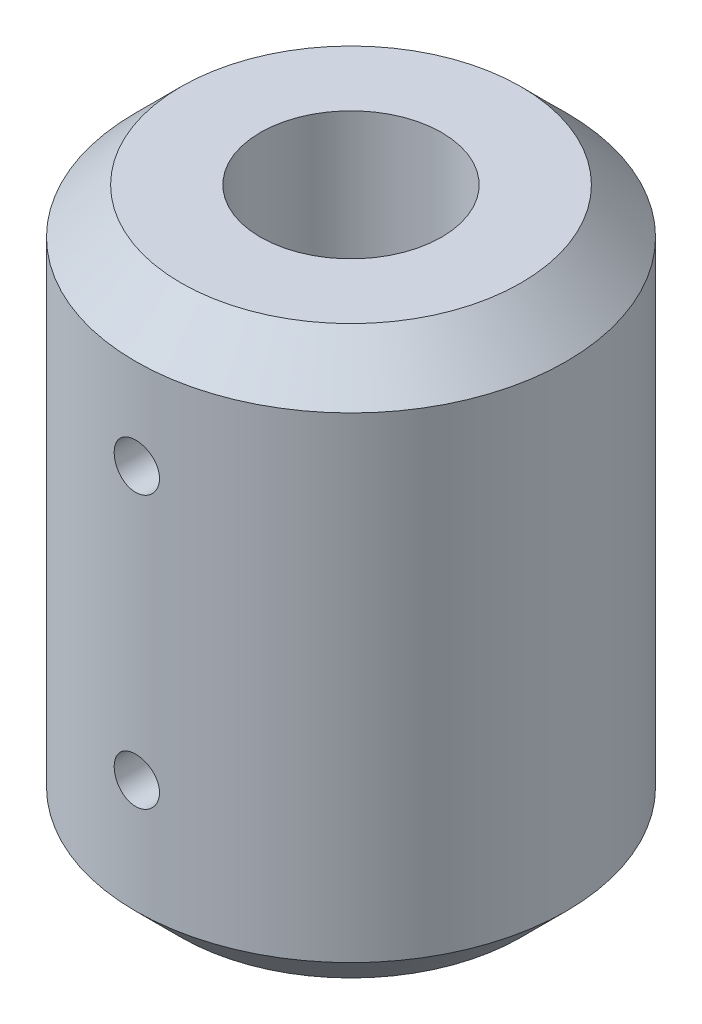
ISO-10303-21;
HEADER;
FILE_DESCRIPTION(('STEP AP214'),'2;1');
FILE_NAME('part.step','',(''),(''),'','','');
FILE_SCHEMA(('AUTOMOTIVE_DESIGN { 1 0 10303 214 1 1 1 1 }'));
ENDSEC;
DATA;
#1=APPLICATION_CONTEXT('core data for automotive mechanical design processes');
#2=APPLICATION_PROTOCOL_DEFINITION('international standard','automotive_design',2000,#1);
#3=PRODUCT_CONTEXT('',#1,'mechanical');
#4=PRODUCT('Part','Part','',(#3));
#5=PRODUCT_RELATED_PRODUCT_CATEGORY('part','',(#4));
#6=PRODUCT_DEFINITION_FORMATION('','',#4);
#7=PRODUCT_DEFINITION_CONTEXT('part definition',#1,'design');
#8=PRODUCT_DEFINITION('design','',#6,#7);
#9=PRODUCT_DEFINITION_SHAPE('','',#8);
#10=(LENGTH_UNIT() NAMED_UNIT(*) SI_UNIT(.MILLI.,.METRE.));
#11=(NAMED_UNIT(*) PLANE_ANGLE_UNIT() SI_UNIT($,.RADIAN.));
#12=(NAMED_UNIT(*) SI_UNIT($,.STERADIAN.) SOLID_ANGLE_UNIT());
#13=UNCERTAINTY_MEASURE_WITH_UNIT(LENGTH_MEASURE(1.E-05),#10,'distance_accuracy_value','');
#14=(GEOMETRIC_REPRESENTATION_CONTEXT(3) GLOBAL_UNCERTAINTY_ASSIGNED_CONTEXT((#13)) GLOBAL_UNIT_ASSIGNED_CONTEXT((#10,
#11,#12)) REPRESENTATION_CONTEXT('',''));
#15=CARTESIAN_POINT('',(0.,0.,0.));
#16=DIRECTION('',(0.,0.,1.));
#17=DIRECTION('',(1.,0.,0.));
#18=AXIS2_PLACEMENT_3D('',#15,#16,#17);
#19=CARTESIAN_POINT('',(0.,15.,0.));
#20=DIRECTION('',(0.,-1.,0.));
#21=DIRECTION('',(0.,0.,-1.));
#22=AXIS2_PLACEMENT_3D('',#19,#20,#21);
#23=CYLINDRICAL_SURFACE('',#22,2.5);
#24=CARTESIAN_POINT('',(1.,7.,2.29128784747792));
#25=CARTESIAN_POINT('',(0.999994127101894,7.05356974904995,2.29129325828211));
#26=CARTESIAN_POINT('',(0.995669909297176,7.10721526735235,2.29319301242133));
#27=CARTESIAN_POINT('',(0.978534515296365,7.21296741643853,2.30055457093922));
#28=CARTESIAN_POINT('',(0.965701652221065,7.26506975854024,2.30602547693426));
#29=CARTESIAN_POINT('',(0.932117516284352,7.36602647098503,2.31980227895648));
#30=CARTESIAN_POINT('',(0.911396076262712,7.41489227368013,2.32809748178557));
#31=CARTESIAN_POINT('',(0.862710134685805,7.50844252542981,2.3465733254764));
#32=CARTESIAN_POINT('',(0.83474721463375,7.55312788457543,2.35675355451961));
#33=CARTESIAN_POINT('',(0.77066098729371,7.63963020112073,2.37850432525516));
#34=CARTESIAN_POINT('',(0.734189678863664,7.68117821146473,2.39011958979373));
#35=CARTESIAN_POINT('',(0.654854552887022,7.75776449865769,2.41306228489405));
#36=CARTESIAN_POINT('',(0.611988510837841,7.79280050064493,2.42438961368186));
#37=CARTESIAN_POINT('',(0.51900315517819,7.85670319849135,2.44601703953427));
#38=CARTESIAN_POINT('',(0.468664482806141,7.88527215073532,2.45625901841784));
#39=CARTESIAN_POINT('',(0.36341266143756,7.9334217841949,2.47401963815773));
#40=CARTESIAN_POINT('',(0.308501384643981,7.95300612289098,2.48153938692337));
#41=CARTESIAN_POINT('',(0.198483213419446,7.9816707432187,2.49269162504142));
#42=CARTESIAN_POINT('',(0.143514492402303,7.99121365704451,2.49649468387678));
#43=CARTESIAN_POINT('',(0.0326331643188255,8.00101424283135,2.50040155341352));
#44=CARTESIAN_POINT('',(-0.0232790829127015,8.00127537796742,2.50050674384656));
#45=CARTESIAN_POINT('',(-0.131116247357656,7.99275861511251,2.49710981410893));
#46=CARTESIAN_POINT('',(-0.183088726437017,7.98448761362654,2.49380998385918));
#47=CARTESIAN_POINT('',(-0.284836554609169,7.96000356184462,2.48424645734395));
#48=CARTESIAN_POINT('',(-0.334611742195079,7.9437899287998,2.47798254360556));
#49=CARTESIAN_POINT('',(-0.431448969255828,7.90368175856185,2.4629841222885));
#50=CARTESIAN_POINT('',(-0.478458811689817,7.87967514259223,2.454213802334));
#51=CARTESIAN_POINT('',(-0.567904075370287,7.8247674965405,2.43507292589849));
#52=CARTESIAN_POINT('',(-0.610337921358054,7.79386410345119,2.42470182132537));
#53=CARTESIAN_POINT('',(-0.692384413996076,7.7236754320267,2.40260818589167));
#54=CARTESIAN_POINT('',(-0.731628922636821,7.68397305370808,2.3908416326012));
#55=CARTESIAN_POINT('',(-0.803053707692663,7.59850471408952,2.36780830482389));
#56=CARTESIAN_POINT('',(-0.835231671879829,7.55273677592292,2.35654169488174));
#57=CARTESIAN_POINT('',(-0.892452094371466,7.45479048879552,2.33548448720906));
#58=CARTESIAN_POINT('',(-0.917267325867452,7.40246758475809,2.3257445709069));
#59=CARTESIAN_POINT('',(-0.957588129983133,7.29389225476899,2.30943795233662));
#60=CARTESIAN_POINT('',(-0.973099749202199,7.23764240761458,2.3028691896167));
#61=CARTESIAN_POINT('',(-0.993477474415979,7.12648211128197,2.29414879836282));
#62=CARTESIAN_POINT('',(-0.998936048404205,7.07169977643992,2.29175183224038));
#63=CARTESIAN_POINT('',(-1.00078066322451,6.96196139611603,2.29094748938549));
#64=CARTESIAN_POINT('',(-0.997169455296441,6.90700540836108,2.29253890281232));
#65=CARTESIAN_POINT('',(-0.981516447394262,6.80177053252256,2.29928022178566));
#66=CARTESIAN_POINT('',(-0.969966531011728,6.75140353130025,2.30422228898885));
#67=CARTESIAN_POINT('',(-0.939402093455638,6.653355797607,2.31685025513936));
#68=CARTESIAN_POINT('',(-0.920385917151196,6.60567566344634,2.32453676244372));
#69=CARTESIAN_POINT('',(-0.874567819740727,6.51219882110226,2.34216890929975));
#70=CARTESIAN_POINT('',(-0.847481434132297,6.46655690565277,2.35219352319567));
#71=CARTESIAN_POINT('',(-0.786582612220937,6.38025850627917,2.37325192578919));
#72=CARTESIAN_POINT('',(-0.752767436740991,6.3396040636022,2.38428612448031));
#73=CARTESIAN_POINT('',(-0.676422105840241,6.26131329570039,2.40710457985699));
#74=CARTESIAN_POINT('',(-0.633432714722549,6.22412171735448,2.41888403642601));
#75=CARTESIAN_POINT('',(-0.541541816684421,6.15741146169483,2.44109897283781));
#76=CARTESIAN_POINT('',(-0.492640069233931,6.12789309670138,2.4515343979662));
#77=CARTESIAN_POINT('',(-0.39013996700088,6.07747618676939,2.46991857950143));
#78=CARTESIAN_POINT('',(-0.336542740497033,6.05657557791711,2.47786793120137));
#79=CARTESIAN_POINT('',(-0.226196795459613,6.02422557379619,2.49036356734645));
#80=CARTESIAN_POINT('',(-0.169449805147135,6.01277104927997,2.49491169853772));
#81=CARTESIAN_POINT('',(-0.0584082551731512,6.00024764918731,2.49989504105256));
#82=CARTESIAN_POINT('',(-0.00419524629652732,5.99854993576867,2.50057923372437));
#83=CARTESIAN_POINT('',(0.103716917866622,6.00392773964205,2.49843021189296));
#84=CARTESIAN_POINT('',(0.157416149697311,6.01100192889281,2.49559752983456));
#85=CARTESIAN_POINT('',(0.261085450973206,6.03327339417924,2.48685756682127));
#86=CARTESIAN_POINT('',(0.311119402324193,6.04821447303778,2.48104740317165));
#87=CARTESIAN_POINT('',(0.407961177379471,6.08552640228091,2.46697473916019));
#88=CARTESIAN_POINT('',(0.454768404133639,6.10789862301017,2.45871178652006));
#89=CARTESIAN_POINT('',(0.546101520928058,6.16055159924467,2.44009047180029));
#90=CARTESIAN_POINT('',(0.590435193403213,6.19113814744254,2.42965564864115));
#91=CARTESIAN_POINT('',(0.673527014262037,6.25889425958947,2.40794701593224));
#92=CARTESIAN_POINT('',(0.712282842872878,6.29606654823006,2.3966728602525));
#93=CARTESIAN_POINT('',(0.785600632542996,6.37865761226253,2.37368881779711));
#94=CARTESIAN_POINT('',(0.819754443599515,6.42444443670056,2.36199516302692));
#95=CARTESIAN_POINT('',(0.879923725219699,6.52147106871439,2.3402483573759));
#96=CARTESIAN_POINT('',(0.905938238949995,6.57271151645493,2.33019539943728));
#97=CARTESIAN_POINT('',(0.946995543836655,6.67451860092404,2.31379432228954));
#98=CARTESIAN_POINT('',(0.962813757082103,6.72473261737559,2.30719459305824));
#99=CARTESIAN_POINT('',(0.986358878909192,6.82724270981517,2.29723001801982));
#100=CARTESIAN_POINT('',(0.994108333944007,6.87953255798348,2.29385616036088));
#101=CARTESIAN_POINT('',(0.999232129155086,6.95468878116896,2.29162229378817));
#102=CARTESIAN_POINT('',(1.00000248449744,6.9773376104988,2.29128555846679));
#103=CARTESIAN_POINT('',(1.,7.,2.29128784747792));
#104=B_SPLINE_CURVE_WITH_KNOTS('',3,(#24,#25,#26,#27,#28,#29,#30,#31,#32,#33,#34,#35,#36,#37,
#38,#39,#40,#41,#42,#43,#44,#45,#46,#47,#48,#49,#50,#51,#52,#53,#54,#55,#56,#57,#58,#59,#60,#61,
#62,#63,#64,#65,#66,#67,#68,#69,#70,#71,#72,#73,#74,#75,#76,#77,#78,#79,#80,#81,#82,#83,#84,#85,
#86,#87,#88,#89,#90,#91,#92,#93,#94,#95,#96,#97,#98,#99,#100,#101,#102,#103),.UNSPECIFIED.,.T.,
.F.,(4,2,2,2,2,2,2,2,2,2,2,2,2,2,2,2,2,2,2,2,2,2,2,2,2,2,2,2,2,2,2,2,2,2,2,2,2,2,2,4),(0.,
0.160638824383827,0.321688667911123,0.482135411646695,0.642547144119307,0.811278091422124,
0.980067871741711,1.15551334545714,1.3308873348474,1.49777091443592,1.66459222652836,
1.82204322415151,1.9795057756453,2.13934150117449,2.29923207470016,2.46962022040678,
2.64006403563564,2.81532229357288,2.99046652397056,3.15491073759215,3.31930507450975,
3.47433624039577,3.62940179322824,3.79075577323355,3.9521755725993,4.12551867120495,
4.29886882423379,4.47217743653411,4.64539187974073,4.80730519874981,4.96919400753306,
5.12610997218681,5.28305488911298,5.44693525566967,5.61088358279108,5.78498126639812,
5.95909940876599,6.11758330406543,6.27562315106627,6.34358052760366),.UNSPECIFIED.);
#105=CARTESIAN_POINT('',(1.,7.,2.29128784747792));
#106=VERTEX_POINT('',#105);
#107=EDGE_CURVE('E73',#106,#106,#104,.T.);
#108=ORIENTED_EDGE('',*,*,#107,.T.);
#109=EDGE_LOOP('',(#108));
#110=FACE_BOUND('',#109,.T.);
#111=CARTESIAN_POINT('',(0.,0.,0.));
#112=DIRECTION('',(0.,1.,0.));
#113=DIRECTION('',(0.,0.,1.));
#114=AXIS2_PLACEMENT_3D('',#111,#112,#113);
#115=CIRCLE('',#114,2.5);
#116=CARTESIAN_POINT('',(0.,0.,2.5));
#117=VERTEX_POINT('',#116);
#118=EDGE_CURVE('E52',#117,#117,#115,.T.);
#119=ORIENTED_EDGE('',*,*,#118,.F.);
#120=EDGE_LOOP('',(#119));
#121=FACE_BOUND('',#120,.T.);
#122=CARTESIAN_POINT('',(0.,14.5,0.));
#123=DIRECTION('',(0.,1.,0.));
#124=DIRECTION('',(0.,0.,1.));
#125=AXIS2_PLACEMENT_3D('',#122,#123,#124);
#126=CIRCLE('',#125,2.5);
#127=CARTESIAN_POINT('',(0.,14.5,2.5));
#128=VERTEX_POINT('',#127);
#129=EDGE_CURVE('E53',#128,#128,#126,.T.);
#130=ORIENTED_EDGE('',*,*,#129,.T.);
#131=EDGE_LOOP('',(#130));
#132=FACE_BOUND('',#131,.T.);
#133=ADVANCED_FACE('F32',(#110,#121,#132),#23,.F.);
#134=CARTESIAN_POINT('',(0.,25.,0.));
#135=DIRECTION('',(0.,-1.,0.));
#136=DIRECTION('',(0.,0.,-1.));
#137=AXIS2_PLACEMENT_3D('',#134,#135,#136);
#138=CYLINDRICAL_SURFACE('',#137,9.5);
#139=CARTESIAN_POINT('',(1.,19.,9.44722181384559));
#140=CARTESIAN_POINT('',(0.999997582005042,19.0560032397777,9.44722250266399));
#141=CARTESIAN_POINT('',(0.995279605314902,19.1120431202978,9.44772516447025));
#142=CARTESIAN_POINT('',(0.976530575638432,19.2225680288041,9.44968112934553));
#143=CARTESIAN_POINT('',(0.962489361408323,19.2770512926085,9.45113546960823));
#144=CARTESIAN_POINT('',(0.925508243054439,19.3828464632756,9.45482827329693));
#145=CARTESIAN_POINT('',(0.902573857494193,19.4341603140365,9.45706625036201));
#146=CARTESIAN_POINT('',(0.848468268709648,19.5321995941397,9.46207356819287));
#147=CARTESIAN_POINT('',(0.817298657421771,19.5789259078986,9.46484280623326));
#148=CARTESIAN_POINT('',(0.747473131447723,19.6666620204887,9.47061306994568));
#149=CARTESIAN_POINT('',(0.708790872156587,19.7076508027159,9.47361488826576));
#150=CARTESIAN_POINT('',(0.625094500148443,19.7825672395736,9.47950490283494));
#151=CARTESIAN_POINT('',(0.58008009314877,19.8164945658454,9.4823930937953));
#152=CARTESIAN_POINT('',(0.484867702730019,19.8763982861469,9.48773832873555));
#153=CARTESIAN_POINT('',(0.43465789460772,19.9023559844204,9.49019435323658));
#154=CARTESIAN_POINT('',(0.330561942132098,19.94546397474,9.49438988246007));
#155=CARTESIAN_POINT('',(0.276675896397674,19.9626145029425,9.49612940639459));
#156=CARTESIAN_POINT('',(0.166970075945796,19.9875594111893,9.49869036912673));
#157=CARTESIAN_POINT('',(0.111158253620166,19.9953884110318,9.4995152042548));
#158=CARTESIAN_POINT('',(-0.000992835185780432,20.0015751791698,9.50016541360392));
#159=CARTESIAN_POINT('',(-0.0573320865818021,19.9999332175105,9.49999081632174));
#160=CARTESIAN_POINT('',(-0.168703652078324,19.9872527055799,9.49866460674142));
#161=CARTESIAN_POINT('',(-0.22374025738018,19.9762513830135,9.4975168652733));
#162=CARTESIAN_POINT('',(-0.331181565951239,19.9452224705672,9.49437776823862));
#163=CARTESIAN_POINT('',(-0.383586231879072,19.9251947526629,9.49238640070667));
#164=CARTESIAN_POINT('',(-0.484393029454017,19.876640981792,9.48777724512953));
#165=CARTESIAN_POINT('',(-0.532787202758799,19.8480985250486,9.4851582498829));
#166=CARTESIAN_POINT('',(-0.624112447479546,19.783337406667,9.47958754859329));
#167=CARTESIAN_POINT('',(-0.667043341182006,19.7471184954257,9.47663583173319));
#168=CARTESIAN_POINT('',(-0.746441553980419,19.6678233845042,9.47071386481717));
#169=CARTESIAN_POINT('',(-0.782876524755558,19.6247147882567,9.46774359429255));
#170=CARTESIAN_POINT('',(-0.847998010788905,19.532976124428,9.46213353822369));
#171=CARTESIAN_POINT('',(-0.876684512719004,19.4843460473496,9.45949375324791));
#172=CARTESIAN_POINT('',(-0.925494983579707,19.3829192311218,9.45484337668268));
#173=CARTESIAN_POINT('',(-0.945616840511519,19.3301214680426,9.45283294031977));
#174=CARTESIAN_POINT('',(-0.9767006464326,19.2218708139736,9.44967206522172));
#175=CARTESIAN_POINT('',(-0.987662905352757,19.1664180128888,9.44852159738819));
#176=CARTESIAN_POINT('',(-1.00007449042648,19.054715696679,9.44721601825639));
#177=CARTESIAN_POINT('',(-1.00156912338335,18.9984712689114,9.44705616649923));
#178=CARTESIAN_POINT('',(-0.995122122181055,18.8865327751216,9.44773740410882));
#179=CARTESIAN_POINT('',(-0.987180629571163,18.8308387008563,9.44857847846089));
#180=CARTESIAN_POINT('',(-0.962124760080203,18.7217146383232,9.45116248557082));
#181=CARTESIAN_POINT('',(-0.945031905000062,18.668279654058,9.45290330202064));
#182=CARTESIAN_POINT('',(-0.902180520375015,18.56503510704,9.457088931172));
#183=CARTESIAN_POINT('',(-0.876421771630254,18.5152256360318,9.45953376168103));
#184=CARTESIAN_POINT('',(-0.816856703395605,18.4204398064142,9.46486340159122));
#185=CARTESIAN_POINT('',(-0.783020420843193,18.3754823698289,9.46774983441864));
#186=CARTESIAN_POINT('',(-0.708303604881556,18.2918688953932,9.47363218095351));
#187=CARTESIAN_POINT('',(-0.667422878089003,18.2532130305897,9.47662809766472));
#188=CARTESIAN_POINT('',(-0.57958081103308,18.1831431965752,9.48240620792166));
#189=CARTESIAN_POINT('',(-0.532595793455963,18.1517588251889,9.48518749827024));
#190=CARTESIAN_POINT('',(-0.43399547707484,18.0973267520771,9.49020976547322));
#191=CARTESIAN_POINT('',(-0.382380247645454,18.0742789254709,9.49245075042118));
#192=CARTESIAN_POINT('',(-0.276087032602513,18.0372240918746,9.49613584419318));
#193=CARTESIAN_POINT('',(-0.22141528336482,18.0231993572501,9.49758151475308));
#194=CARTESIAN_POINT('',(-0.110476924029595,18.0045309951903,9.49951951574434));
#195=CARTESIAN_POINT('',(-0.0542103639989415,17.9998870735873,9.50001187606999));
#196=CARTESIAN_POINT('',(0.0580300347921221,18.0001165557393,9.49998774184331));
#197=CARTESIAN_POINT('',(0.114003974054026,18.0049440725307,9.49947611139555));
#198=CARTESIAN_POINT('',(0.224340884848702,18.0238829882135,9.49751109070018));
#199=CARTESIAN_POINT('',(0.278703855507501,18.0379943921416,9.49605769994164));
#200=CARTESIAN_POINT('',(0.384274195424409,18.0750874580646,9.49237193768829));
#201=CARTESIAN_POINT('',(0.43548210097553,18.0980676077137,9.490139699013));
#202=CARTESIAN_POINT('',(0.533321310522369,18.1522410052497,9.48514475079928));
#203=CARTESIAN_POINT('',(0.579952625423965,18.1834342335645,9.48238204252499));
#204=CARTESIAN_POINT('',(0.667550047988317,18.2533200569526,9.4766194383916));
#205=CARTESIAN_POINT('',(0.708488814694208,18.2920468371438,9.47361849971248));
#206=CARTESIAN_POINT('',(0.78330647985384,18.3758319975186,9.46772640505434));
#207=CARTESIAN_POINT('',(0.817183686602055,18.4208918905783,9.46483527551713));
#208=CARTESIAN_POINT('',(0.876992670192274,18.5162033615308,9.45948152841544));
#209=CARTESIAN_POINT('',(0.902902032073806,18.5664690634569,9.4570201280027));
#210=CARTESIAN_POINT('',(0.945877463600505,18.6706322617773,9.45281896154563));
#211=CARTESIAN_POINT('',(0.962953439690974,18.7245256128207,9.45107838754954));
#212=CARTESIAN_POINT('',(0.983551575010372,18.8155994306155,9.44895178678448));
#213=CARTESIAN_POINT('',(0.989711221415894,18.8521990162058,9.44830614572659));
#214=CARTESIAN_POINT('',(0.997936224550726,18.9258603824105,9.44744093225495));
#215=CARTESIAN_POINT('',(1.00000160087218,18.9629221608122,9.44722135780237));
#216=CARTESIAN_POINT('',(1.,19.,9.44722181384559));
#217=B_SPLINE_CURVE_WITH_KNOTS('',3,(#139,#140,#141,#142,#143,#144,#145,#146,#147,#148,#149,
#150,#151,#152,#153,#154,#155,#156,#157,#158,#159,#160,#161,#162,#163,#164,#165,#166,#167,#168,
#169,#170,#171,#172,#173,#174,#175,#176,#177,#178,#179,#180,#181,#182,#183,#184,#185,#186,#187,
#188,#189,#190,#191,#192,#193,#194,#195,#196,#197,#198,#199,#200,#201,#202,#203,#204,#205,#206,
#207,#208,#209,#210,#211,#212,#213,#214,#215,#216),.UNSPECIFIED.,.T.,.F.,(4,2,2,2,2,2,2,2,2,2,2,
2,2,2,2,2,2,2,2,2,2,2,2,2,2,2,2,2,2,2,2,2,2,2,2,2,2,2,4),(0.,0.167874308515836,
0.335931881467918,0.503885334527946,0.671806344537529,0.840327196784642,1.00885588352368,
1.17777694897953,1.34669348473242,1.51498069435804,1.68326310564076,1.8508792712072,
2.01849781420309,2.18644138555292,2.35439041849689,2.52315376360364,2.69191739899768,
2.86072262658685,3.029522142127,3.1975132627483,3.36550186340294,3.53309711962096,
3.70069661540384,3.86892774419037,4.03716349197577,4.20607244449904,4.37497886667638,
4.54355241740059,4.71212068184014,4.87987428784667,5.04762798486012,5.21535308824674,
5.38307779193977,5.55158212557547,5.72012678074431,5.88914133377591,6.05796592756899,
6.16911032609436,6.28025419276376),.UNSPECIFIED.);
#218=CARTESIAN_POINT('',(1.,19.,9.44722181384559));
#219=VERTEX_POINT('',#218);
#220=EDGE_CURVE('E92',#219,#219,#217,.T.);
#221=ORIENTED_EDGE('',*,*,#220,.F.);
#222=EDGE_LOOP('',(#221));
#223=FACE_BOUND('',#222,.T.);
#224=CARTESIAN_POINT('',(1.,7.,9.44722181384559));
#225=CARTESIAN_POINT('',(0.99999758200504,7.05600323977769,9.44722250266399));
#226=CARTESIAN_POINT('',(0.995279605314901,7.1120431202978,9.44772516447025));
#227=CARTESIAN_POINT('',(0.97653057563843,7.22256802880414,9.44968112934553));
#228=CARTESIAN_POINT('',(0.962489361408322,7.27705129260845,9.45113546960823));
#229=CARTESIAN_POINT('',(0.925508243054437,7.38284646327565,9.45482827329693));
#230=CARTESIAN_POINT('',(0.902573857494191,7.43416031403647,9.45706625036201));
#231=CARTESIAN_POINT('',(0.848468268709646,7.53219959413971,9.46207356819287));
#232=CARTESIAN_POINT('',(0.817298657421768,7.57892590789863,9.46484280623326));
#233=CARTESIAN_POINT('',(0.747473131447721,7.66666202048867,9.47061306994568));
#234=CARTESIAN_POINT('',(0.708790872156584,7.70765080271592,9.47361488826576));
#235=CARTESIAN_POINT('',(0.62509450014844,7.78256723957361,9.47950490283494));
#236=CARTESIAN_POINT('',(0.580080093148766,7.81649456584542,9.4823930937953));
#237=CARTESIAN_POINT('',(0.484867702730016,7.87639828614689,9.48773832873555));
#238=CARTESIAN_POINT('',(0.434657894607717,7.90235598442036,9.49019435323658));
#239=CARTESIAN_POINT('',(0.330561942132095,7.94546397473997,9.49438988246007));
#240=CARTESIAN_POINT('',(0.276675896397673,7.96261450294246,9.49612940639459));
#241=CARTESIAN_POINT('',(0.166970075945795,7.98755941118926,9.49869036912673));
#242=CARTESIAN_POINT('',(0.111158253620164,7.99538841103176,9.4995152042548));
#243=CARTESIAN_POINT('',(-0.000992835185782065,8.00157517916979,9.50016541360392));
#244=CARTESIAN_POINT('',(-0.0573320865818038,7.99993321751047,9.49999081632174));
#245=CARTESIAN_POINT('',(-0.168703652078326,7.98725270557985,9.49866460674142));
#246=CARTESIAN_POINT('',(-0.223740257380181,7.97625138301352,9.4975168652733));
#247=CARTESIAN_POINT('',(-0.331181565951239,7.94522247056722,9.49437776823862));
#248=CARTESIAN_POINT('',(-0.383586231879072,7.92519475266294,9.49238640070667));
#249=CARTESIAN_POINT('',(-0.484393029454017,7.87664098179201,9.48777724512953));
#250=CARTESIAN_POINT('',(-0.532787202758799,7.84809852504856,9.4851582498829));
#251=CARTESIAN_POINT('',(-0.624112447479546,7.78333740666697,9.47958754859329));
#252=CARTESIAN_POINT('',(-0.667043341182006,7.74711849542568,9.47663583173319));
#253=CARTESIAN_POINT('',(-0.746441553980418,7.66782338450425,9.47071386481717));
#254=CARTESIAN_POINT('',(-0.782876524755558,7.62471478825671,9.46774359429255));
#255=CARTESIAN_POINT('',(-0.847998010788905,7.532976124428,9.46213353822369));
#256=CARTESIAN_POINT('',(-0.876684512719004,7.48434604734956,9.45949375324791));
#257=CARTESIAN_POINT('',(-0.925494983579706,7.38291923112184,9.45484337668268));
#258=CARTESIAN_POINT('',(-0.945616840511517,7.33012146804264,9.45283294031977));
#259=CARTESIAN_POINT('',(-0.976700646432598,7.22187081397363,9.44967206522172));
#260=CARTESIAN_POINT('',(-0.987662905352755,7.16641801288878,9.44852159738819));
#261=CARTESIAN_POINT('',(-1.00007449042647,7.05471569667896,9.44721601825639));
#262=CARTESIAN_POINT('',(-1.00156912338335,6.9984712689114,9.44705616649923));
#263=CARTESIAN_POINT('',(-0.995122122181053,6.88653277512161,9.44773740410882));
#264=CARTESIAN_POINT('',(-0.987180629571162,6.83083870085629,9.44857847846089));
#265=CARTESIAN_POINT('',(-0.962124760080201,6.72171463832316,9.45116248557082));
#266=CARTESIAN_POINT('',(-0.945031905000059,6.66827965405797,9.45290330202064));
#267=CARTESIAN_POINT('',(-0.902180520375012,6.56503510704003,9.457088931172));
#268=CARTESIAN_POINT('',(-0.876421771630252,6.51522563603178,9.45953376168103));
#269=CARTESIAN_POINT('',(-0.816856703395602,6.42043980641424,9.46486340159122));
#270=CARTESIAN_POINT('',(-0.78302042084319,6.3754823698289,9.46774983441864));
#271=CARTESIAN_POINT('',(-0.708303604881554,6.29186889539325,9.47363218095351));
#272=CARTESIAN_POINT('',(-0.667422878089002,6.25321303058971,9.47662809766472));
#273=CARTESIAN_POINT('',(-0.579580811033079,6.18314319657521,9.48240620792166));
#274=CARTESIAN_POINT('',(-0.532595793455962,6.15175882518888,9.48518749827024));
#275=CARTESIAN_POINT('',(-0.433995477074838,6.09732675207709,9.49020976547322));
#276=CARTESIAN_POINT('',(-0.382380247645451,6.07427892547094,9.49245075042118));
#277=CARTESIAN_POINT('',(-0.27608703260251,6.03722409187461,9.49613584419318));
#278=CARTESIAN_POINT('',(-0.221415283364817,6.02319935725015,9.49758151475308));
#279=CARTESIAN_POINT('',(-0.110476924029592,6.00453099519028,9.49951951574434));
#280=CARTESIAN_POINT('',(-0.0542103639989384,5.99988707358727,9.50001187606999));
#281=CARTESIAN_POINT('',(0.0580300347921246,6.0001165557393,9.49998774184331));
#282=CARTESIAN_POINT('',(0.114003974054028,6.00494407253066,9.49947611139555));
#283=CARTESIAN_POINT('',(0.224340884848703,6.02388298821353,9.49751109070018));
#284=CARTESIAN_POINT('',(0.278703855507502,6.03799439214156,9.49605769994164));
#285=CARTESIAN_POINT('',(0.38427419542441,6.07508745806463,9.49237193768829));
#286=CARTESIAN_POINT('',(0.43548210097553,6.09806760771371,9.490139699013));
#287=CARTESIAN_POINT('',(0.533321310522369,6.15224100524974,9.48514475079928));
#288=CARTESIAN_POINT('',(0.579952625423966,6.18343423356451,9.48238204252499));
#289=CARTESIAN_POINT('',(0.667550047988317,6.25332005695263,9.4766194383916));
#290=CARTESIAN_POINT('',(0.708488814694207,6.29204683714375,9.47361849971248));
#291=CARTESIAN_POINT('',(0.783306479853838,6.37583199751859,9.46772640505434));
#292=CARTESIAN_POINT('',(0.817183686602054,6.42089189057828,9.46483527551713));
#293=CARTESIAN_POINT('',(0.876992670192274,6.51620336153076,9.45948152841544));
#294=CARTESIAN_POINT('',(0.902902032073805,6.56646906345693,9.4570201280027));
#295=CARTESIAN_POINT('',(0.945877463600504,6.6706322617773,9.45281896154563));
#296=CARTESIAN_POINT('',(0.962953439690973,6.7245256128207,9.45107838754954));
#297=CARTESIAN_POINT('',(0.98355157501037,6.81559943061549,9.44895178678448));
#298=CARTESIAN_POINT('',(0.989711221415893,6.85219901620581,9.44830614572659));
#299=CARTESIAN_POINT('',(0.997936224550725,6.92586038241047,9.44744093225495));
#300=CARTESIAN_POINT('',(1.00000160087218,6.96292216081225,9.44722135780237));
#301=CARTESIAN_POINT('',(1.,7.,9.44722181384559));
#302=B_SPLINE_CURVE_WITH_KNOTS('',3,(#224,#225,#226,#227,#228,#229,#230,#231,#232,#233,#234,
#235,#236,#237,#238,#239,#240,#241,#242,#243,#244,#245,#246,#247,#248,#249,#250,#251,#252,#253,
#254,#255,#256,#257,#258,#259,#260,#261,#262,#263,#264,#265,#266,#267,#268,#269,#270,#271,#272,
#273,#274,#275,#276,#277,#278,#279,#280,#281,#282,#283,#284,#285,#286,#287,#288,#289,#290,#291,
#292,#293,#294,#295,#296,#297,#298,#299,#300,#301),.UNSPECIFIED.,.T.,.F.,(4,2,2,2,2,2,2,2,2,2,2,
2,2,2,2,2,2,2,2,2,2,2,2,2,2,2,2,2,2,2,2,2,2,2,2,2,2,2,4),(0.,0.167874308515836,
0.335931881467919,0.503885334527945,0.671806344537528,0.840327196784645,1.00885588352368,
1.17777694897953,1.34669348473242,1.51498069435804,1.68326310564076,1.8508792712072,
2.01849781420309,2.18644138555292,2.35439041849688,2.52315376360364,2.69191739899767,
2.86072262658684,3.02952214212699,3.19751326274829,3.36550186340294,3.53309711962096,
3.70069661540383,3.86892774419037,4.03716349197577,4.20607244449903,4.37497886667638,
4.54355241740059,4.71212068184014,4.87987428784667,5.04762798486011,5.21535308824674,
5.38307779193977,5.55158212557546,5.72012678074431,5.8891413337759,6.05796592756899,
6.16911032609435,6.28025419276375),.UNSPECIFIED.);
#303=CARTESIAN_POINT('',(1.,7.,9.44722181384559));
#304=VERTEX_POINT('',#303);
#305=EDGE_CURVE('E65',#304,#304,#302,.T.);
#306=ORIENTED_EDGE('',*,*,#305,.F.);
#307=EDGE_LOOP('',(#306));
#308=FACE_BOUND('',#307,.T.);
#309=CARTESIAN_POINT('',(0.,2.,0.));
#310=DIRECTION('',(0.,1.,0.));
#311=DIRECTION('',(0.,0.,1.));
#312=AXIS2_PLACEMENT_3D('',#309,#310,#311);
#313=CIRCLE('',#312,9.5);
#314=CARTESIAN_POINT('',(0.,2.,9.5));
#315=VERTEX_POINT('',#314);
#316=EDGE_CURVE('E43',#315,#315,#313,.T.);
#317=ORIENTED_EDGE('',*,*,#316,.T.);
#318=EDGE_LOOP('',(#317));
#319=FACE_BOUND('',#318,.T.);
#320=CARTESIAN_POINT('',(0.,23.,0.));
#321=DIRECTION('',(0.,1.,0.));
#322=DIRECTION('',(0.,0.,1.));
#323=AXIS2_PLACEMENT_3D('',#320,#321,#322);
#324=CIRCLE('',#323,9.5);
#325=CARTESIAN_POINT('',(0.,23.,9.5));
#326=VERTEX_POINT('',#325);
#327=EDGE_CURVE('E47',#326,#326,#324,.F.);
#328=ORIENTED_EDGE('',*,*,#327,.T.);
#329=EDGE_LOOP('',(#328));
#330=FACE_BOUND('',#329,.T.);
#331=ADVANCED_FACE('F115',(#223,#308,#319,#330),#138,.T.);
#332=CARTESIAN_POINT('',(0.,25.,0.));
#333=DIRECTION('',(0.,1.,0.));
#334=DIRECTION('',(0.,0.,1.));
#335=AXIS2_PLACEMENT_3D('',#332,#333,#334);
#336=PLANE('',#335);
#337=CARTESIAN_POINT('',(0.,25.,0.));
#338=DIRECTION('',(0.,1.,0.));
#339=DIRECTION('',(0.,0.,1.));
#340=AXIS2_PLACEMENT_3D('',#337,#338,#339);
#341=CIRCLE('',#340,7.5);
#342=CARTESIAN_POINT('',(0.,25.,7.5));
#343=VERTEX_POINT('',#342);
#344=EDGE_CURVE('E10',#343,#343,#341,.T.);
#345=ORIENTED_EDGE('',*,*,#344,.T.);
#346=EDGE_LOOP('',(#345));
#347=FACE_BOUND('',#346,.T.);
#348=CARTESIAN_POINT('',(0.,25.,0.));
#349=DIRECTION('',(0.,1.,0.));
#350=DIRECTION('',(0.,0.,1.));
#351=AXIS2_PLACEMENT_3D('',#348,#349,#350);
#352=CIRCLE('',#351,4.);
#353=CARTESIAN_POINT('',(0.,25.,4.));
#354=VERTEX_POINT('',#353);
#355=EDGE_CURVE('E56',#354,#354,#352,.T.);
#356=ORIENTED_EDGE('',*,*,#355,.F.);
#357=EDGE_LOOP('',(#356));
#358=FACE_BOUND('',#357,.T.);
#359=ADVANCED_FACE('F118',(#347,#358),#336,.T.);
#360=CARTESIAN_POINT('',(0.,0.,0.));
#361=DIRECTION('',(0.,1.,0.));
#362=DIRECTION('',(0.,0.,1.));
#363=AXIS2_PLACEMENT_3D('',#360,#361,#362);
#364=PLANE('',#363);
#365=CARTESIAN_POINT('',(0.,0.,0.));
#366=DIRECTION('',(0.,1.,0.));
#367=DIRECTION('',(0.,0.,1.));
#368=AXIS2_PLACEMENT_3D('',#365,#366,#367);
#369=CIRCLE('',#368,7.49999999999999);
#370=CARTESIAN_POINT('',(0.,0.,7.49999999999999));
#371=VERTEX_POINT('',#370);
#372=EDGE_CURVE('E39',#371,#371,#369,.F.);
#373=ORIENTED_EDGE('',*,*,#372,.T.);
#374=EDGE_LOOP('',(#373));
#375=FACE_BOUND('',#374,.T.);
#376=ORIENTED_EDGE('',*,*,#118,.T.);
#377=EDGE_LOOP('',(#376));
#378=FACE_BOUND('',#377,.T.);
#379=ADVANCED_FACE('F143',(#375,#378),#364,.F.);
#380=CARTESIAN_POINT('',(0.,25.,0.));
#381=DIRECTION('',(0.,-1.,0.));
#382=DIRECTION('',(0.,0.,-1.));
#383=AXIS2_PLACEMENT_3D('',#380,#381,#382);
#384=CYLINDRICAL_SURFACE('',#383,4.);
#385=CARTESIAN_POINT('',(1.,19.,3.87298334620742));
#386=CARTESIAN_POINT('',(0.9999984314387,19.0552203003568,3.87298440057185));
#387=CARTESIAN_POINT('',(0.99541049820807,19.1104579594314,3.87417722499279));
#388=CARTESIAN_POINT('',(0.977209250194447,19.2193470312326,3.87880744892249));
#389=CARTESIAN_POINT('',(0.963590682698078,19.27299750178,3.8822461547418));
#390=CARTESIAN_POINT('',(0.927796479849636,19.3771214152878,3.89095489813012));
#391=CARTESIAN_POINT('',(0.905631891140945,19.4275988621578,3.8962225706936));
#392=CARTESIAN_POINT('',(0.853408456505408,19.5241243410125,3.90799276818327));
#393=CARTESIAN_POINT('',(0.823349275424506,19.5701721848311,3.91449534553241));
#394=CARTESIAN_POINT('',(0.755483370924518,19.6575446581058,3.92816286540368));
#395=CARTESIAN_POINT('',(0.717534755081557,19.6987574401403,3.93533839048709));
#396=CARTESIAN_POINT('',(0.635272825640327,19.7743045577439,3.94945150206622));
#397=CARTESIAN_POINT('',(0.59095891767214,19.8086382502486,3.95638906626691));
#398=CARTESIAN_POINT('',(0.496458080431565,19.8699101870526,3.96936166208095));
#399=CARTESIAN_POINT('',(0.446197830478044,19.8967385552646,3.975382749602));
#400=CARTESIAN_POINT('',(0.341705273717109,19.9415238576612,3.9857232477043));
#401=CARTESIAN_POINT('',(0.287473554316777,19.9594821007662,3.99004290933747));
#402=CARTESIAN_POINT('',(0.177743503501663,19.9856591338314,3.99641903539262));
#403=CARTESIAN_POINT('',(0.12229308781959,19.9940678577306,3.99851957537723));
#404=CARTESIAN_POINT('',(0.010731527705108,20.0015033517102,4.00037437642922));
#405=CARTESIAN_POINT('',(-0.0453795178152277,20.0005315088838,4.00012898438682));
#406=CARTESIAN_POINT('',(-0.155352247172388,19.9893700598999,3.99735237981413));
#407=CARTESIAN_POINT('',(-0.209236215601067,19.9793854699785,3.99487200936349));
#408=CARTESIAN_POINT('',(-0.314538247413687,19.9508114919806,3.98796334609942));
#409=CARTESIAN_POINT('',(-0.365956179370439,19.932221645849,3.98353494959376));
#410=CARTESIAN_POINT('',(-0.465406703501808,19.8867989717252,3.97315003880358));
#411=CARTESIAN_POINT('',(-0.513404509766506,19.8598931821353,3.96718007878021));
#412=CARTESIAN_POINT('',(-0.604275622340491,19.7986577283535,3.9543596152386));
#413=CARTESIAN_POINT('',(-0.647148035085508,19.7643267725758,3.94750895860996));
#414=CARTESIAN_POINT('',(-0.72777403508496,19.6881165032071,3.93345485507808));
#415=CARTESIAN_POINT('',(-0.765357679075202,19.6460580430609,3.92624687810367));
#416=CARTESIAN_POINT('',(-0.832976375963021,19.5561600105839,3.91246017406682));
#417=CARTESIAN_POINT('',(-0.863011076046018,19.5083201682036,3.90588147642388));
#418=CARTESIAN_POINT('',(-0.914788129022599,19.4078839863404,3.89408198732659));
#419=CARTESIAN_POINT('',(-0.936489566970492,19.3552657078747,3.88886793490288));
#420=CARTESIAN_POINT('',(-0.970685620636342,19.2469658127694,3.88047456055983));
#421=CARTESIAN_POINT('',(-0.983182206552911,19.1912848544067,3.87729480324087));
#422=CARTESIAN_POINT('',(-0.998331855466072,19.0800161993907,3.87342142415656));
#423=CARTESIAN_POINT('',(-1.00123618956785,19.0244648826681,3.87266435637459));
#424=CARTESIAN_POINT('',(-0.99780679620622,18.9136712253687,3.87354937392416));
#425=CARTESIAN_POINT('',(-0.991473919139521,18.8584288568195,3.87519123840506));
#426=CARTESIAN_POINT('',(-0.969970185575065,18.7507542940181,3.88062832781824));
#427=CARTESIAN_POINT('',(-0.954945627312698,18.6982909093717,3.8843878809375));
#428=CARTESIAN_POINT('',(-0.916647232668248,18.5966274168593,3.89360287308385));
#429=CARTESIAN_POINT('',(-0.893372419085018,18.5474276963779,3.89905851299445));
#430=CARTESIAN_POINT('',(-0.838708267174623,18.4526234888531,3.91118454837305));
#431=CARTESIAN_POINT('',(-0.807168701534253,18.4071084639828,3.91787667442657));
#432=CARTESIAN_POINT('',(-0.737060292934457,18.3219246548795,3.93166833228686));
#433=CARTESIAN_POINT('',(-0.69849029480544,18.28225683334,3.93876793091388));
#434=CARTESIAN_POINT('',(-0.614262720984727,18.2088755829716,3.95278961212642));
#435=CARTESIAN_POINT('',(-0.568451952531593,18.1753359749805,3.95970280824734));
#436=CARTESIAN_POINT('',(-0.471702682694676,18.1164256532195,3.97238886645494));
#437=CARTESIAN_POINT('',(-0.420764448957592,18.0910545133567,3.97816178801584));
#438=CARTESIAN_POINT('',(-0.315558201731091,18.0494215861888,3.98788046295326));
#439=CARTESIAN_POINT('',(-0.261317381027882,18.0330942862484,3.99183932008964));
#440=CARTESIAN_POINT('',(-0.150749760318808,18.0098158661566,3.99754117358315));
#441=CARTESIAN_POINT('',(-0.0944233650412435,18.0028629365044,3.99928459757363));
#442=CARTESIAN_POINT('',(0.0170835264433269,17.9986324104245,4.00034169408811));
#443=CARTESIAN_POINT('',(0.0722538269660339,18.0010982909046,3.99971978880008));
#444=CARTESIAN_POINT('',(0.181367496414741,18.0150478272943,3.99625896457423));
#445=CARTESIAN_POINT('',(0.235310901780888,18.0265312150131,3.99342011157094));
#446=CARTESIAN_POINT('',(0.340171035644817,18.0580522197709,3.98585432853963));
#447=CARTESIAN_POINT('',(0.39110249458102,18.0780434533146,3.98113764502668));
#448=CARTESIAN_POINT('',(0.488917053041469,18.1259705790193,3.97031288913382));
#449=CARTESIAN_POINT('',(0.535799641265052,18.1539074726696,3.96420464137727));
#450=CARTESIAN_POINT('',(0.625401928423901,18.2177152339971,3.95107249681342));
#451=CARTESIAN_POINT('',(0.667994988300588,18.2537601429074,3.94403016945647));
#452=CARTESIAN_POINT('',(0.746615020271252,18.3324228519738,3.92990649053207));
#453=CARTESIAN_POINT('',(0.782640325068178,18.3750423160979,3.92282512952424));
#454=CARTESIAN_POINT('',(0.847762026479241,18.4666014142013,3.90927475860682));
#455=CARTESIAN_POINT('',(0.876716619446595,18.5156441234125,3.90281963730391));
#456=CARTESIAN_POINT('',(0.925926896615624,18.6180554899228,3.8914395555011));
#457=CARTESIAN_POINT('',(0.946188909759558,18.6714209661073,3.88651348244814));
#458=CARTESIAN_POINT('',(0.974422528565572,18.7705770118263,3.87951908741315));
#459=CARTESIAN_POINT('',(0.98399317059583,18.8158931643824,3.87708663005761));
#460=CARTESIAN_POINT('',(0.996782292572821,18.9074688690015,3.87381838580358));
#461=CARTESIAN_POINT('',(1.00000131437052,18.9537283402506,3.87298246270639));
#462=CARTESIAN_POINT('',(1.,19.,3.87298334620742));
#463=B_SPLINE_CURVE_WITH_KNOTS('',3,(#385,#386,#387,#388,#389,#390,#391,#392,#393,#394,#395,
#396,#397,#398,#399,#400,#401,#402,#403,#404,#405,#406,#407,#408,#409,#410,#411,#412,#413,#414,
#415,#416,#417,#418,#419,#420,#421,#422,#423,#424,#425,#426,#427,#428,#429,#430,#431,#432,#433,
#434,#435,#436,#437,#438,#439,#440,#441,#442,#443,#444,#445,#446,#447,#448,#449,#450,#451,#452,
#453,#454,#455,#456,#457,#458,#459,#460,#461,#462),.UNSPECIFIED.,.T.,.F.,(4,2,2,2,2,2,2,2,2,2,2,
2,2,2,2,2,2,2,2,2,2,2,2,2,2,2,2,2,2,2,2,2,2,2,2,2,2,2,4),(0.,0.165490976675234,
0.331078296534212,0.496452290829153,0.66183330698466,0.830495816734655,0.999174085882213,
1.17020598555443,1.34121263935112,1.50875500394413,1.67627259462683,1.84007305071854,
2.00388222686189,2.16917149698053,2.3344895418384,2.5042818662504,2.67408212476196,
2.84470572799636,3.01529280048094,3.18137429900962,3.34744050869796,3.51078961999958,
3.67415808564842,3.84073138339938,4.00733207550293,4.17810132382403,4.34886166284096,
4.51836829119047,4.6878421955989,4.85273378447258,5.01762046947068,5.1816195062016,
5.34563922291504,5.51358838629104,5.68158012622479,5.85270590910146,6.02370688542923,
6.16239130867207,6.30106390036084),.UNSPECIFIED.);
#464=CARTESIAN_POINT('',(1.,19.,3.87298334620742));
#465=VERTEX_POINT('',#464);
#466=EDGE_CURVE('E62',#465,#465,#463,.T.);
#467=ORIENTED_EDGE('',*,*,#466,.T.);
#468=EDGE_LOOP('',(#467));
#469=FACE_BOUND('',#468,.T.);
#470=ORIENTED_EDGE('',*,*,#355,.T.);
#471=EDGE_LOOP('',(#470));
#472=FACE_BOUND('',#471,.T.);
#473=CARTESIAN_POINT('',(0.,14.5,0.));
#474=DIRECTION('',(0.,1.,0.));
#475=DIRECTION('',(0.,0.,1.));
#476=AXIS2_PLACEMENT_3D('',#473,#474,#475);
#477=CIRCLE('',#476,4.);
#478=CARTESIAN_POINT('',(0.,14.5,4.));
#479=VERTEX_POINT('',#478);
#480=EDGE_CURVE('E59',#479,#479,#477,.T.);
#481=ORIENTED_EDGE('',*,*,#480,.F.);
#482=EDGE_LOOP('',(#481));
#483=FACE_BOUND('',#482,.T.);
#484=ADVANCED_FACE('F139',(#469,#472,#483),#384,.F.);
#485=CARTESIAN_POINT('',(0.,14.5,0.));
#486=DIRECTION('',(0.,1.,0.));
#487=DIRECTION('',(0.,0.,1.));
#488=AXIS2_PLACEMENT_3D('',#485,#486,#487);
#489=PLANE('',#488);
#490=ORIENTED_EDGE('',*,*,#129,.F.);
#491=EDGE_LOOP('',(#490));
#492=FACE_BOUND('',#491,.T.);
#493=ORIENTED_EDGE('',*,*,#480,.T.);
#494=EDGE_LOOP('',(#493));
#495=FACE_BOUND('',#494,.T.);
#496=ADVANCED_FACE('F131',(#492,#495),#489,.T.);
#497=CARTESIAN_POINT('',(0.,2.,0.));
#498=DIRECTION('',(0.,1.,0.));
#499=DIRECTION('',(0.,0.,1.));
#500=AXIS2_PLACEMENT_3D('',#497,#498,#499);
#501=CONICAL_SURFACE('',#500,9.5,0.78539816339745);
#502=ORIENTED_EDGE('',*,*,#372,.F.);
#503=EDGE_LOOP('',(#502));
#504=FACE_BOUND('',#503,.T.);
#505=ORIENTED_EDGE('',*,*,#316,.F.);
#506=EDGE_LOOP('',(#505));
#507=FACE_BOUND('',#506,.T.);
#508=ADVANCED_FACE('F127',(#504,#507),#501,.T.);
#509=CARTESIAN_POINT('',(0.,25.,0.));
#510=DIRECTION('',(0.,-1.,0.));
#511=DIRECTION('',(0.,0.,-1.));
#512=AXIS2_PLACEMENT_3D('',#509,#510,#511);
#513=CONICAL_SURFACE('',#512,7.5,0.785398163397447);
#514=ORIENTED_EDGE('',*,*,#327,.F.);
#515=EDGE_LOOP('',(#514));
#516=FACE_BOUND('',#515,.T.);
#517=ORIENTED_EDGE('',*,*,#344,.F.);
#518=EDGE_LOOP('',(#517));
#519=FACE_BOUND('',#518,.T.);
#520=ADVANCED_FACE('F34',(#516,#519),#513,.T.);
#521=CARTESIAN_POINT('',(0.,19.,-9.501));
#522=DIRECTION('',(0.,0.,1.));
#523=DIRECTION('',(1.,0.,0.));
#524=AXIS2_PLACEMENT_3D('',#521,#522,#523);
#525=CYLINDRICAL_SURFACE('',#524,1.);
#526=ORIENTED_EDGE('',*,*,#466,.F.);
#527=EDGE_LOOP('',(#526));
#528=FACE_BOUND('',#527,.T.);
#529=ORIENTED_EDGE('',*,*,#220,.T.);
#530=EDGE_LOOP('',(#529));
#531=FACE_BOUND('',#530,.T.);
#532=ADVANCED_FACE('F83',(#528,#531),#525,.F.);
#533=CARTESIAN_POINT('',(0.,7.,-9.501));
#534=DIRECTION('',(0.,0.,1.));
#535=DIRECTION('',(1.,0.,0.));
#536=AXIS2_PLACEMENT_3D('',#533,#534,#535);
#537=CYLINDRICAL_SURFACE('',#536,1.);
#538=ORIENTED_EDGE('',*,*,#107,.F.);
#539=EDGE_LOOP('',(#538));
#540=FACE_BOUND('',#539,.T.);
#541=ORIENTED_EDGE('',*,*,#305,.T.);
#542=EDGE_LOOP('',(#541));
#543=FACE_BOUND('',#542,.T.);
#544=ADVANCED_FACE('F79',(#540,#543),#537,.F.);
#545=CLOSED_SHELL('',(#133,#331,#359,#379,#484,#496,#508,#520,#532,#544));
#546=MANIFOLD_SOLID_BREP('B2',#545);
#547=ADVANCED_BREP_SHAPE_REPRESENTATION('',(#18,#546),#14);
#548=SHAPE_DEFINITION_REPRESENTATION(#9,#547);
ENDSEC;
END-ISO-10303-21;
